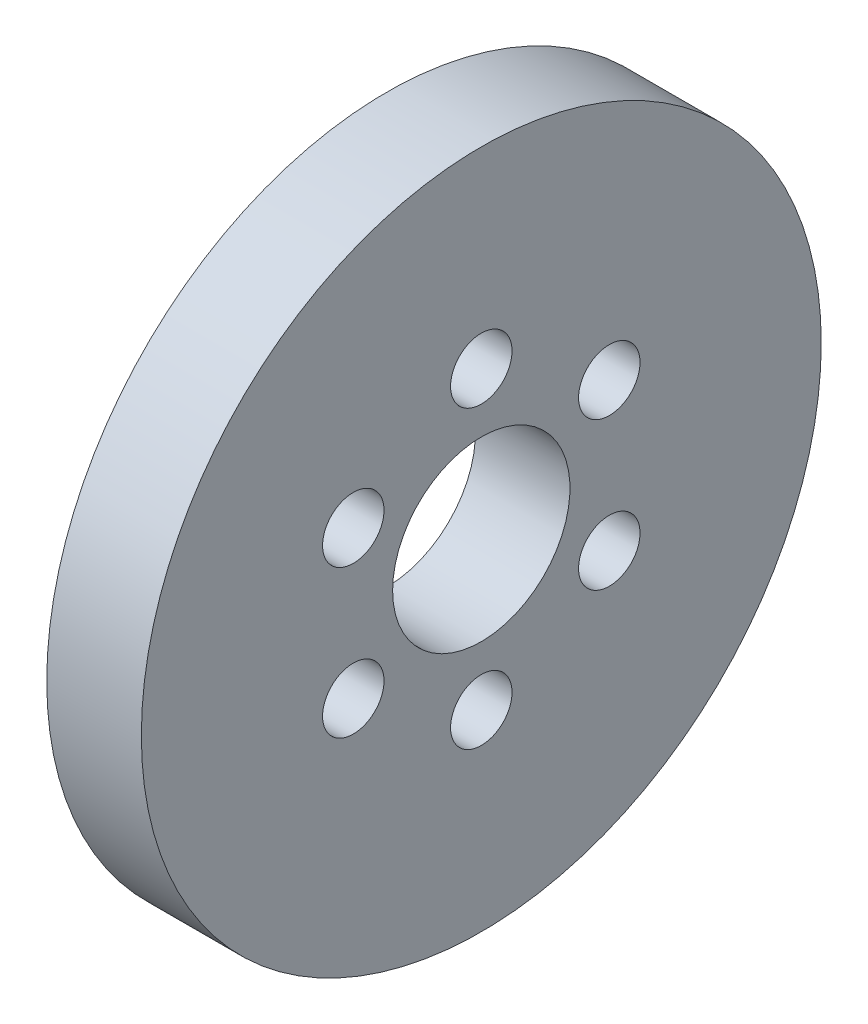
ISO-10303-21;
HEADER;
FILE_DESCRIPTION(('STEP AP214'),'2;1');
FILE_NAME('part.step','',(''),(''),'','','');
FILE_SCHEMA(('AUTOMOTIVE_DESIGN { 1 0 10303 214 1 1 1 1 }'));
ENDSEC;
DATA;
#1=APPLICATION_CONTEXT('core data for automotive mechanical design processes');
#2=APPLICATION_PROTOCOL_DEFINITION('international standard','automotive_design',2000,#1);
#3=PRODUCT_CONTEXT('',#1,'mechanical');
#4=PRODUCT('Part','Part','',(#3));
#5=PRODUCT_RELATED_PRODUCT_CATEGORY('part','',(#4));
#6=PRODUCT_DEFINITION_FORMATION('','',#4);
#7=PRODUCT_DEFINITION_CONTEXT('part definition',#1,'design');
#8=PRODUCT_DEFINITION('design','',#6,#7);
#9=PRODUCT_DEFINITION_SHAPE('','',#8);
#10=(LENGTH_UNIT() NAMED_UNIT(*) SI_UNIT(.MILLI.,.METRE.));
#11=(NAMED_UNIT(*) PLANE_ANGLE_UNIT() SI_UNIT($,.RADIAN.));
#12=(NAMED_UNIT(*) SI_UNIT($,.STERADIAN.) SOLID_ANGLE_UNIT());
#13=UNCERTAINTY_MEASURE_WITH_UNIT(LENGTH_MEASURE(1.E-05),#10,'distance_accuracy_value','');
#14=(GEOMETRIC_REPRESENTATION_CONTEXT(3) GLOBAL_UNCERTAINTY_ASSIGNED_CONTEXT((#13)) GLOBAL_UNIT_ASSIGNED_CONTEXT((#10,
#11,#12)) REPRESENTATION_CONTEXT('',''));
#15=CARTESIAN_POINT('',(0.,0.,0.));
#16=DIRECTION('',(0.,0.,1.));
#17=DIRECTION('',(1.,0.,0.));
#18=AXIS2_PLACEMENT_3D('',#15,#16,#17);
#19=CARTESIAN_POINT('',(5.08,0.,0.));
#20=DIRECTION('',(-1.,0.,0.));
#21=DIRECTION('',(0.,0.,-1.));
#22=AXIS2_PLACEMENT_3D('',#19,#20,#21);
#23=CYLINDRICAL_SURFACE('',#22,18.25625);
#24=CARTESIAN_POINT('',(5.08,0.,0.));
#25=DIRECTION('',(-1.,0.,0.));
#26=DIRECTION('',(0.,0.,1.));
#27=AXIS2_PLACEMENT_3D('',#24,#25,#26);
#28=CIRCLE('',#27,18.25625);
#29=CARTESIAN_POINT('',(5.08,0.,18.25625));
#30=VERTEX_POINT('',#29);
#31=EDGE_CURVE('E10',#30,#30,#28,.T.);
#32=ORIENTED_EDGE('',*,*,#31,.T.);
#33=EDGE_LOOP('',(#32));
#34=FACE_BOUND('',#33,.T.);
#35=CARTESIAN_POINT('',(0.,0.,0.));
#36=DIRECTION('',(-1.,0.,0.));
#37=DIRECTION('',(0.,0.,1.));
#38=AXIS2_PLACEMENT_3D('',#35,#36,#37);
#39=CIRCLE('',#38,18.25625);
#40=CARTESIAN_POINT('',(0.,0.,18.25625));
#41=VERTEX_POINT('',#40);
#42=EDGE_CURVE('E42',#41,#41,#39,.T.);
#43=ORIENTED_EDGE('',*,*,#42,.F.);
#44=EDGE_LOOP('',(#43));
#45=FACE_BOUND('',#44,.T.);
#46=ADVANCED_FACE('F35',(#34,#45),#23,.T.);
#47=CARTESIAN_POINT('',(5.08,0.,0.));
#48=DIRECTION('',(1.,0.,0.));
#49=DIRECTION('',(0.,0.,1.));
#50=AXIS2_PLACEMENT_3D('',#47,#48,#49);
#51=PLANE('',#50);
#52=CARTESIAN_POINT('',(5.08,0.,0.));
#53=DIRECTION('',(-1.,0.,0.));
#54=DIRECTION('',(0.,0.,1.));
#55=AXIS2_PLACEMENT_3D('',#52,#53,#54);
#56=CIRCLE('',#55,4.76249999999999);
#57=CARTESIAN_POINT('',(5.08,0.,4.76249999999999));
#58=VERTEX_POINT('',#57);
#59=EDGE_CURVE('E84',#58,#58,#56,.T.);
#60=ORIENTED_EDGE('',*,*,#59,.T.);
#61=EDGE_LOOP('',(#60));
#62=FACE_BOUND('',#61,.T.);
#63=CARTESIAN_POINT('',(5.08,7.9375,0.));
#64=DIRECTION('',(-1.,0.,0.));
#65=DIRECTION('',(0.,0.,1.));
#66=AXIS2_PLACEMENT_3D('',#63,#64,#65);
#67=CIRCLE('',#66,1.65099999999999);
#68=CARTESIAN_POINT('',(5.08,7.9375,1.65099999999999));
#69=VERTEX_POINT('',#68);
#70=EDGE_CURVE('E81',#69,#69,#67,.T.);
#71=ORIENTED_EDGE('',*,*,#70,.T.);
#72=EDGE_LOOP('',(#71));
#73=FACE_BOUND('',#72,.T.);
#74=CARTESIAN_POINT('',(5.08,3.96874999999998,6.87407664253899));
#75=DIRECTION('',(-1.,0.,0.));
#76=DIRECTION('',(0.,0.,1.));
#77=AXIS2_PLACEMENT_3D('',#74,#75,#76);
#78=CIRCLE('',#77,1.65099999999999);
#79=CARTESIAN_POINT('',(5.08,3.96874999999998,8.52507664253898));
#80=VERTEX_POINT('',#79);
#81=EDGE_CURVE('E75',#80,#80,#78,.T.);
#82=ORIENTED_EDGE('',*,*,#81,.T.);
#83=EDGE_LOOP('',(#82));
#84=FACE_BOUND('',#83,.T.);
#85=CARTESIAN_POINT('',(5.08,-3.96875000000003,6.87407664253896));
#86=DIRECTION('',(-1.,0.,0.));
#87=DIRECTION('',(0.,0.,1.));
#88=AXIS2_PLACEMENT_3D('',#85,#86,#87);
#89=CIRCLE('',#88,1.65099999999999);
#90=CARTESIAN_POINT('',(5.08,-3.96875000000003,8.52507664253895));
#91=VERTEX_POINT('',#90);
#92=EDGE_CURVE('E69',#91,#91,#89,.T.);
#93=ORIENTED_EDGE('',*,*,#92,.T.);
#94=EDGE_LOOP('',(#93));
#95=FACE_BOUND('',#94,.T.);
#96=CARTESIAN_POINT('',(5.08,-7.9375,0.));
#97=DIRECTION('',(-1.,0.,0.));
#98=DIRECTION('',(0.,0.,1.));
#99=AXIS2_PLACEMENT_3D('',#96,#97,#98);
#100=CIRCLE('',#99,1.65099999999999);
#101=CARTESIAN_POINT('',(5.08,-7.9375,1.65099999999993));
#102=VERTEX_POINT('',#101);
#103=EDGE_CURVE('E63',#102,#102,#100,.T.);
#104=ORIENTED_EDGE('',*,*,#103,.T.);
#105=EDGE_LOOP('',(#104));
#106=FACE_BOUND('',#105,.T.);
#107=CARTESIAN_POINT('',(5.08,-3.96874999999994,-6.87407664253902));
#108=DIRECTION('',(-1.,0.,0.));
#109=DIRECTION('',(0.,0.,1.));
#110=AXIS2_PLACEMENT_3D('',#107,#108,#109);
#111=CIRCLE('',#110,1.65099999999999);
#112=CARTESIAN_POINT('',(5.08,-3.96874999999994,-5.22307664253903));
#113=VERTEX_POINT('',#112);
#114=EDGE_CURVE('E57',#113,#113,#111,.T.);
#115=ORIENTED_EDGE('',*,*,#114,.T.);
#116=EDGE_LOOP('',(#115));
#117=FACE_BOUND('',#116,.T.);
#118=CARTESIAN_POINT('',(5.08,3.96875000000008,-6.87407664253894));
#119=DIRECTION('',(-1.,0.,0.));
#120=DIRECTION('',(0.,0.,1.));
#121=AXIS2_PLACEMENT_3D('',#118,#119,#120);
#122=CIRCLE('',#121,1.65099999999999);
#123=CARTESIAN_POINT('',(5.08,3.96875000000008,-5.22307664253895));
#124=VERTEX_POINT('',#123);
#125=EDGE_CURVE('E51',#124,#124,#122,.T.);
#126=ORIENTED_EDGE('',*,*,#125,.T.);
#127=EDGE_LOOP('',(#126));
#128=FACE_BOUND('',#127,.T.);
#129=ORIENTED_EDGE('',*,*,#31,.F.);
#130=EDGE_LOOP('',(#129));
#131=FACE_BOUND('',#130,.T.);
#132=ADVANCED_FACE('F97',(#62,#73,#84,#95,#106,#117,#128,#131),#51,.T.);
#133=CARTESIAN_POINT('',(0.,0.,0.));
#134=DIRECTION('',(1.,0.,0.));
#135=DIRECTION('',(0.,0.,1.));
#136=AXIS2_PLACEMENT_3D('',#133,#134,#135);
#137=PLANE('',#136);
#138=CARTESIAN_POINT('',(0.,0.,0.));
#139=DIRECTION('',(-1.,0.,0.));
#140=DIRECTION('',(0.,0.,1.));
#141=AXIS2_PLACEMENT_3D('',#138,#139,#140);
#142=CIRCLE('',#141,4.76249999999999);
#143=CARTESIAN_POINT('',(0.,0.,4.76249999999999));
#144=VERTEX_POINT('',#143);
#145=EDGE_CURVE('E38',#144,#144,#142,.T.);
#146=ORIENTED_EDGE('',*,*,#145,.F.);
#147=EDGE_LOOP('',(#146));
#148=FACE_BOUND('',#147,.T.);
#149=CARTESIAN_POINT('',(0.,7.9375,0.));
#150=DIRECTION('',(-1.,0.,0.));
#151=DIRECTION('',(0.,0.,1.));
#152=AXIS2_PLACEMENT_3D('',#149,#150,#151);
#153=CIRCLE('',#152,1.65099999999999);
#154=CARTESIAN_POINT('',(0.,7.9375,1.65099999999999));
#155=VERTEX_POINT('',#154);
#156=EDGE_CURVE('E78',#155,#155,#153,.T.);
#157=ORIENTED_EDGE('',*,*,#156,.F.);
#158=EDGE_LOOP('',(#157));
#159=FACE_BOUND('',#158,.T.);
#160=CARTESIAN_POINT('',(0.,3.96874999999998,6.87407664253899));
#161=DIRECTION('',(-1.,0.,0.));
#162=DIRECTION('',(0.,0.,1.));
#163=AXIS2_PLACEMENT_3D('',#160,#161,#162);
#164=CIRCLE('',#163,1.65099999999999);
#165=CARTESIAN_POINT('',(0.,3.96874999999998,8.52507664253898));
#166=VERTEX_POINT('',#165);
#167=EDGE_CURVE('E72',#166,#166,#164,.T.);
#168=ORIENTED_EDGE('',*,*,#167,.F.);
#169=EDGE_LOOP('',(#168));
#170=FACE_BOUND('',#169,.T.);
#171=CARTESIAN_POINT('',(0.,-3.96875000000003,6.87407664253896));
#172=DIRECTION('',(-1.,0.,0.));
#173=DIRECTION('',(0.,0.,1.));
#174=AXIS2_PLACEMENT_3D('',#171,#172,#173);
#175=CIRCLE('',#174,1.65099999999999);
#176=CARTESIAN_POINT('',(0.,-3.96875000000003,8.52507664253896));
#177=VERTEX_POINT('',#176);
#178=EDGE_CURVE('E66',#177,#177,#175,.T.);
#179=ORIENTED_EDGE('',*,*,#178,.F.);
#180=EDGE_LOOP('',(#179));
#181=FACE_BOUND('',#180,.T.);
#182=CARTESIAN_POINT('',(0.,-7.9375,0.));
#183=DIRECTION('',(-1.,0.,0.));
#184=DIRECTION('',(0.,0.,1.));
#185=AXIS2_PLACEMENT_3D('',#182,#183,#184);
#186=CIRCLE('',#185,1.65099999999999);
#187=CARTESIAN_POINT('',(0.,-7.9375,1.65099999999994));
#188=VERTEX_POINT('',#187);
#189=EDGE_CURVE('E60',#188,#188,#186,.T.);
#190=ORIENTED_EDGE('',*,*,#189,.F.);
#191=EDGE_LOOP('',(#190));
#192=FACE_BOUND('',#191,.T.);
#193=CARTESIAN_POINT('',(0.,-3.96874999999994,-6.87407664253902));
#194=DIRECTION('',(-1.,0.,0.));
#195=DIRECTION('',(0.,0.,1.));
#196=AXIS2_PLACEMENT_3D('',#193,#194,#195);
#197=CIRCLE('',#196,1.65099999999999);
#198=CARTESIAN_POINT('',(0.,-3.96874999999994,-5.22307664253903));
#199=VERTEX_POINT('',#198);
#200=EDGE_CURVE('E54',#199,#199,#197,.T.);
#201=ORIENTED_EDGE('',*,*,#200,.F.);
#202=EDGE_LOOP('',(#201));
#203=FACE_BOUND('',#202,.T.);
#204=CARTESIAN_POINT('',(0.,3.96875000000008,-6.87407664253894));
#205=DIRECTION('',(-1.,0.,0.));
#206=DIRECTION('',(0.,0.,1.));
#207=AXIS2_PLACEMENT_3D('',#204,#205,#206);
#208=CIRCLE('',#207,1.65099999999999);
#209=CARTESIAN_POINT('',(0.,3.96875000000008,-5.22307664253894));
#210=VERTEX_POINT('',#209);
#211=EDGE_CURVE('E47',#210,#210,#208,.T.);
#212=ORIENTED_EDGE('',*,*,#211,.F.);
#213=EDGE_LOOP('',(#212));
#214=FACE_BOUND('',#213,.T.);
#215=ORIENTED_EDGE('',*,*,#42,.T.);
#216=EDGE_LOOP('',(#215));
#217=FACE_BOUND('',#216,.T.);
#218=ADVANCED_FACE('F93',(#148,#159,#170,#181,#192,#203,#214,#217),#137,.F.);
#219=CARTESIAN_POINT('',(5.08,3.96875000000008,-6.87407664253894));
#220=DIRECTION('',(1.,0.,0.));
#221=DIRECTION('',(0.,0.,1.));
#222=AXIS2_PLACEMENT_3D('',#219,#220,#221);
#223=CYLINDRICAL_SURFACE('',#222,1.65099999999999);
#224=ORIENTED_EDGE('',*,*,#211,.T.);
#225=EDGE_LOOP('',(#224));
#226=FACE_BOUND('',#225,.T.);
#227=ORIENTED_EDGE('',*,*,#125,.F.);
#228=EDGE_LOOP('',(#227));
#229=FACE_BOUND('',#228,.T.);
#230=ADVANCED_FACE('F96',(#226,#229),#223,.F.);
#231=CARTESIAN_POINT('',(5.08,-3.96874999999994,-6.87407664253902));
#232=DIRECTION('',(1.,0.,0.));
#233=DIRECTION('',(0.,0.,1.));
#234=AXIS2_PLACEMENT_3D('',#231,#232,#233);
#235=CYLINDRICAL_SURFACE('',#234,1.65099999999999);
#236=ORIENTED_EDGE('',*,*,#200,.T.);
#237=EDGE_LOOP('',(#236));
#238=FACE_BOUND('',#237,.T.);
#239=ORIENTED_EDGE('',*,*,#114,.F.);
#240=EDGE_LOOP('',(#239));
#241=FACE_BOUND('',#240,.T.);
#242=ADVANCED_FACE('F123',(#238,#241),#235,.F.);
#243=CARTESIAN_POINT('',(5.08,-7.9375,0.));
#244=DIRECTION('',(1.,0.,0.));
#245=DIRECTION('',(0.,0.,1.));
#246=AXIS2_PLACEMENT_3D('',#243,#244,#245);
#247=CYLINDRICAL_SURFACE('',#246,1.65099999999999);
#248=ORIENTED_EDGE('',*,*,#189,.T.);
#249=EDGE_LOOP('',(#248));
#250=FACE_BOUND('',#249,.T.);
#251=ORIENTED_EDGE('',*,*,#103,.F.);
#252=EDGE_LOOP('',(#251));
#253=FACE_BOUND('',#252,.T.);
#254=ADVANCED_FACE('F127',(#250,#253),#247,.F.);
#255=CARTESIAN_POINT('',(5.08,-3.96875000000003,6.87407664253896));
#256=DIRECTION('',(1.,0.,0.));
#257=DIRECTION('',(0.,0.,1.));
#258=AXIS2_PLACEMENT_3D('',#255,#256,#257);
#259=CYLINDRICAL_SURFACE('',#258,1.65099999999999);
#260=ORIENTED_EDGE('',*,*,#178,.T.);
#261=EDGE_LOOP('',(#260));
#262=FACE_BOUND('',#261,.T.);
#263=ORIENTED_EDGE('',*,*,#92,.F.);
#264=EDGE_LOOP('',(#263));
#265=FACE_BOUND('',#264,.T.);
#266=ADVANCED_FACE('F131',(#262,#265),#259,.F.);
#267=CARTESIAN_POINT('',(5.08,3.96874999999998,6.87407664253899));
#268=DIRECTION('',(1.,0.,0.));
#269=DIRECTION('',(0.,0.,1.));
#270=AXIS2_PLACEMENT_3D('',#267,#268,#269);
#271=CYLINDRICAL_SURFACE('',#270,1.65099999999999);
#272=ORIENTED_EDGE('',*,*,#167,.T.);
#273=EDGE_LOOP('',(#272));
#274=FACE_BOUND('',#273,.T.);
#275=ORIENTED_EDGE('',*,*,#81,.F.);
#276=EDGE_LOOP('',(#275));
#277=FACE_BOUND('',#276,.T.);
#278=ADVANCED_FACE('F135',(#274,#277),#271,.F.);
#279=CARTESIAN_POINT('',(5.08,7.9375,0.));
#280=DIRECTION('',(1.,0.,0.));
#281=DIRECTION('',(0.,0.,1.));
#282=AXIS2_PLACEMENT_3D('',#279,#280,#281);
#283=CYLINDRICAL_SURFACE('',#282,1.65099999999999);
#284=ORIENTED_EDGE('',*,*,#156,.T.);
#285=EDGE_LOOP('',(#284));
#286=FACE_BOUND('',#285,.T.);
#287=ORIENTED_EDGE('',*,*,#70,.F.);
#288=EDGE_LOOP('',(#287));
#289=FACE_BOUND('',#288,.T.);
#290=ADVANCED_FACE('F139',(#286,#289),#283,.F.);
#291=CARTESIAN_POINT('',(5.08,0.,0.));
#292=DIRECTION('',(1.,0.,0.));
#293=DIRECTION('',(0.,0.,1.));
#294=AXIS2_PLACEMENT_3D('',#291,#292,#293);
#295=CYLINDRICAL_SURFACE('',#294,4.76249999999999);
#296=ORIENTED_EDGE('',*,*,#59,.F.);
#297=EDGE_LOOP('',(#296));
#298=FACE_BOUND('',#297,.T.);
#299=ORIENTED_EDGE('',*,*,#145,.T.);
#300=EDGE_LOOP('',(#299));
#301=FACE_BOUND('',#300,.T.);
#302=ADVANCED_FACE('F91',(#298,#301),#295,.F.);
#303=CLOSED_SHELL('',(#46,#132,#218,#230,#242,#254,#266,#278,#290,#302));
#304=MANIFOLD_SOLID_BREP('B2',#303);
#305=ADVANCED_BREP_SHAPE_REPRESENTATION('',(#18,#304),#14);
#306=SHAPE_DEFINITION_REPRESENTATION(#9,#305);
ENDSEC;
END-ISO-10303-21;
